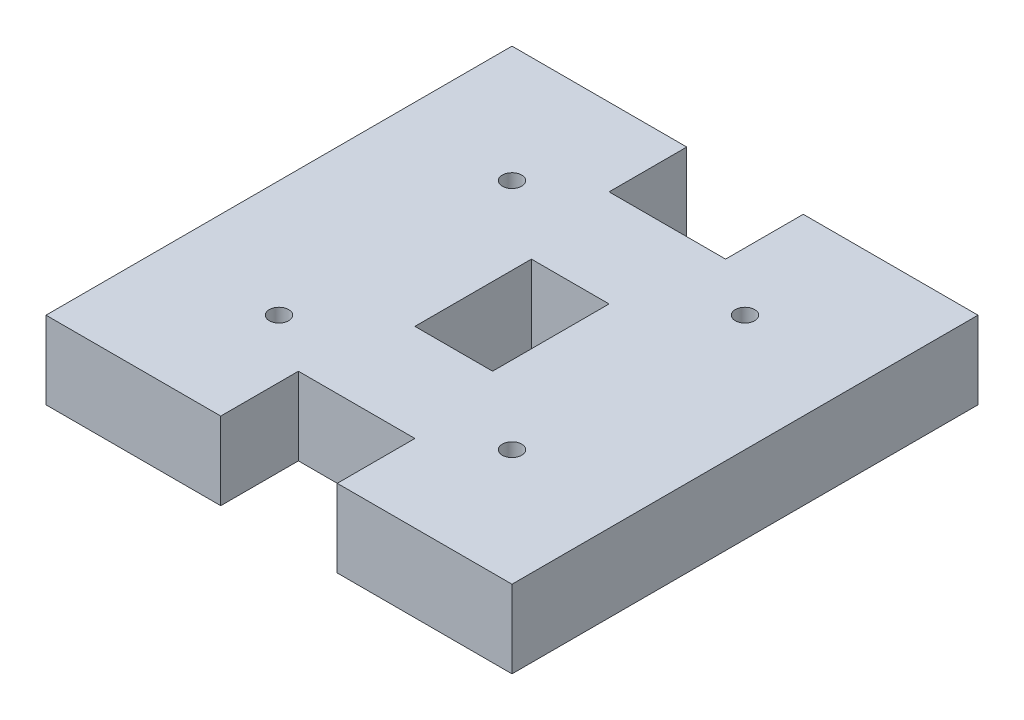
ISO-10303-21;
HEADER;
FILE_DESCRIPTION(('STEP AP214'),'2;1');
FILE_NAME('part.step','',(''),(''),'','','');
FILE_SCHEMA(('AUTOMOTIVE_DESIGN { 1 0 10303 214 1 1 1 1 }'));
ENDSEC;
DATA;
#1=APPLICATION_CONTEXT('core data for automotive mechanical design processes');
#2=APPLICATION_PROTOCOL_DEFINITION('international standard','automotive_design',2000,#1);
#3=PRODUCT_CONTEXT('',#1,'mechanical');
#4=PRODUCT('Part','Part','',(#3));
#5=PRODUCT_RELATED_PRODUCT_CATEGORY('part','',(#4));
#6=PRODUCT_DEFINITION_FORMATION('','',#4);
#7=PRODUCT_DEFINITION_CONTEXT('part definition',#1,'design');
#8=PRODUCT_DEFINITION('design','',#6,#7);
#9=PRODUCT_DEFINITION_SHAPE('','',#8);
#10=(LENGTH_UNIT() NAMED_UNIT(*) SI_UNIT(.MILLI.,.METRE.));
#11=(NAMED_UNIT(*) PLANE_ANGLE_UNIT() SI_UNIT($,.RADIAN.));
#12=(NAMED_UNIT(*) SI_UNIT($,.STERADIAN.) SOLID_ANGLE_UNIT());
#13=UNCERTAINTY_MEASURE_WITH_UNIT(LENGTH_MEASURE(1.E-05),#10,'distance_accuracy_value','');
#14=(GEOMETRIC_REPRESENTATION_CONTEXT(3) GLOBAL_UNCERTAINTY_ASSIGNED_CONTEXT((#13)) GLOBAL_UNIT_ASSIGNED_CONTEXT((#10,
#11,#12)) REPRESENTATION_CONTEXT('',''));
#15=CARTESIAN_POINT('',(0.,0.,0.));
#16=DIRECTION('',(0.,0.,1.));
#17=DIRECTION('',(1.,0.,0.));
#18=AXIS2_PLACEMENT_3D('',#15,#16,#17);
#19=CARTESIAN_POINT('',(60.,10.,-60.));
#20=DIRECTION('',(0.,0.,1.));
#21=DIRECTION('',(1.,0.,0.));
#22=AXIS2_PLACEMENT_3D('',#19,#20,#21);
#23=PLANE('',#22);
#24=DIRECTION('',(-1.,0.,0.));
#25=VECTOR('',#24,1.);
#26=CARTESIAN_POINT('',(60.,10.,-60.));
#27=LINE('',#26,#25);
#28=CARTESIAN_POINT('',(22.5,10.,-60.));
#29=VERTEX_POINT('',#28);
#30=CARTESIAN_POINT('',(0.,10.,-60.));
#31=VERTEX_POINT('',#30);
#32=EDGE_CURVE('E245',#29,#31,#27,.T.);
#33=ORIENTED_EDGE('',*,*,#32,.F.);
#34=DIRECTION('',(0.,1.,0.));
#35=VECTOR('',#34,1.);
#36=CARTESIAN_POINT('',(22.5,0.,-60.));
#37=LINE('',#36,#35);
#38=CARTESIAN_POINT('',(22.5,0.,-60.));
#39=VERTEX_POINT('',#38);
#40=EDGE_CURVE('E191',#39,#29,#37,.T.);
#41=ORIENTED_EDGE('',*,*,#40,.F.);
#42=DIRECTION('',(-1.,0.,0.));
#43=VECTOR('',#42,1.);
#44=CARTESIAN_POINT('',(60.,0.,-60.));
#45=LINE('',#44,#43);
#46=CARTESIAN_POINT('',(0.,0.,-60.));
#47=VERTEX_POINT('',#46);
#48=EDGE_CURVE('E258',#39,#47,#45,.T.);
#49=ORIENTED_EDGE('',*,*,#48,.T.);
#50=DIRECTION('',(0.,-1.,0.));
#51=VECTOR('',#50,1.);
#52=CARTESIAN_POINT('',(0.,10.,-60.));
#53=LINE('',#52,#51);
#54=EDGE_CURVE('E249',#31,#47,#53,.T.);
#55=ORIENTED_EDGE('',*,*,#54,.F.);
#56=EDGE_LOOP('',(#33,#41,#49,#55));
#57=FACE_BOUND('',#56,.T.);
#58=ADVANCED_FACE('F33',(#57),#23,.F.);
#59=CARTESIAN_POINT('',(0.,10.,0.));
#60=DIRECTION('',(0.,0.,-1.));
#61=DIRECTION('',(-1.,0.,0.));
#62=AXIS2_PLACEMENT_3D('',#59,#60,#61);
#63=PLANE('',#62);
#64=DIRECTION('',(1.,0.,0.));
#65=VECTOR('',#64,1.);
#66=CARTESIAN_POINT('',(0.,10.,0.));
#67=LINE('',#66,#65);
#68=CARTESIAN_POINT('',(37.5,10.,0.));
#69=VERTEX_POINT('',#68);
#70=CARTESIAN_POINT('',(60.,10.,0.));
#71=VERTEX_POINT('',#70);
#72=EDGE_CURVE('E238',#69,#71,#67,.T.);
#73=ORIENTED_EDGE('',*,*,#72,.F.);
#74=DIRECTION('',(0.,1.,0.));
#75=VECTOR('',#74,1.);
#76=CARTESIAN_POINT('',(37.5,0.,0.));
#77=LINE('',#76,#75);
#78=CARTESIAN_POINT('',(37.5,0.,0.));
#79=VERTEX_POINT('',#78);
#80=EDGE_CURVE('E215',#79,#69,#77,.T.);
#81=ORIENTED_EDGE('',*,*,#80,.F.);
#82=DIRECTION('',(1.,0.,0.));
#83=VECTOR('',#82,1.);
#84=CARTESIAN_POINT('',(0.,0.,0.));
#85=LINE('',#84,#83);
#86=CARTESIAN_POINT('',(60.,0.,0.));
#87=VERTEX_POINT('',#86);
#88=EDGE_CURVE('E252',#79,#87,#85,.T.);
#89=ORIENTED_EDGE('',*,*,#88,.T.);
#90=DIRECTION('',(0.,-1.,0.));
#91=VECTOR('',#90,1.);
#92=CARTESIAN_POINT('',(60.,10.,0.));
#93=LINE('',#92,#91);
#94=EDGE_CURVE('E41',#71,#87,#93,.T.);
#95=ORIENTED_EDGE('',*,*,#94,.F.);
#96=EDGE_LOOP('',(#73,#81,#89,#95));
#97=FACE_BOUND('',#96,.T.);
#98=ADVANCED_FACE('F290',(#97),#63,.F.);
#99=CARTESIAN_POINT('',(0.,10.,-60.));
#100=DIRECTION('',(1.,0.,0.));
#101=DIRECTION('',(0.,0.,-1.));
#102=AXIS2_PLACEMENT_3D('',#99,#100,#101);
#103=PLANE('',#102);
#104=DIRECTION('',(0.,0.,1.));
#105=VECTOR('',#104,1.);
#106=CARTESIAN_POINT('',(0.,0.,-60.));
#107=LINE('',#106,#105);
#108=CARTESIAN_POINT('',(0.,0.,0.));
#109=VERTEX_POINT('',#108);
#110=EDGE_CURVE('E228',#47,#109,#107,.T.);
#111=ORIENTED_EDGE('',*,*,#110,.T.);
#112=DIRECTION('',(0.,-1.,0.));
#113=VECTOR('',#112,1.);
#114=CARTESIAN_POINT('',(0.,10.,0.));
#115=LINE('',#114,#113);
#116=CARTESIAN_POINT('',(0.,10.,0.));
#117=VERTEX_POINT('',#116);
#118=EDGE_CURVE('E11',#117,#109,#115,.T.);
#119=ORIENTED_EDGE('',*,*,#118,.F.);
#120=DIRECTION('',(0.,0.,1.));
#121=VECTOR('',#120,1.);
#122=CARTESIAN_POINT('',(0.,10.,-60.));
#123=LINE('',#122,#121);
#124=EDGE_CURVE('E235',#31,#117,#123,.T.);
#125=ORIENTED_EDGE('',*,*,#124,.F.);
#126=ORIENTED_EDGE('',*,*,#54,.T.);
#127=EDGE_LOOP('',(#111,#119,#125,#126));
#128=FACE_BOUND('',#127,.T.);
#129=ADVANCED_FACE('F35',(#128),#103,.F.);
#130=CARTESIAN_POINT('',(22.5,0.,0.));
#131=VERTEX_POINT('',#130);
#132=EDGE_CURVE('E253',#109,#131,#85,.T.);
#133=ORIENTED_EDGE('',*,*,#132,.T.);
#134=DIRECTION('',(0.,-1.,0.));
#135=VECTOR('',#134,1.);
#136=CARTESIAN_POINT('',(22.5,10.,0.));
#137=LINE('',#136,#135);
#138=CARTESIAN_POINT('',(22.5,10.,0.));
#139=VERTEX_POINT('',#138);
#140=EDGE_CURVE('E204',#139,#131,#137,.T.);
#141=ORIENTED_EDGE('',*,*,#140,.F.);
#142=EDGE_CURVE('E240',#117,#139,#67,.T.);
#143=ORIENTED_EDGE('',*,*,#142,.F.);
#144=ORIENTED_EDGE('',*,*,#118,.T.);
#145=EDGE_LOOP('',(#133,#141,#143,#144));
#146=FACE_BOUND('',#145,.T.);
#147=ADVANCED_FACE('F303',(#146),#63,.F.);
#148=CARTESIAN_POINT('',(60.,10.,0.));
#149=DIRECTION('',(-1.,0.,0.));
#150=DIRECTION('',(0.,0.,1.));
#151=AXIS2_PLACEMENT_3D('',#148,#149,#150);
#152=PLANE('',#151);
#153=DIRECTION('',(0.,0.,-1.));
#154=VECTOR('',#153,1.);
#155=CARTESIAN_POINT('',(60.,0.,0.));
#156=LINE('',#155,#154);
#157=CARTESIAN_POINT('',(60.,0.,-60.));
#158=VERTEX_POINT('',#157);
#159=EDGE_CURVE('E256',#87,#158,#156,.T.);
#160=ORIENTED_EDGE('',*,*,#159,.T.);
#161=DIRECTION('',(0.,-1.,0.));
#162=VECTOR('',#161,1.);
#163=CARTESIAN_POINT('',(60.,10.,-60.));
#164=LINE('',#163,#162);
#165=CARTESIAN_POINT('',(60.,10.,-60.));
#166=VERTEX_POINT('',#165);
#167=EDGE_CURVE('E263',#166,#158,#164,.T.);
#168=ORIENTED_EDGE('',*,*,#167,.F.);
#169=DIRECTION('',(0.,0.,-1.));
#170=VECTOR('',#169,1.);
#171=CARTESIAN_POINT('',(60.,10.,0.));
#172=LINE('',#171,#170);
#173=EDGE_CURVE('E243',#71,#166,#172,.T.);
#174=ORIENTED_EDGE('',*,*,#173,.F.);
#175=ORIENTED_EDGE('',*,*,#94,.T.);
#176=EDGE_LOOP('',(#160,#168,#174,#175));
#177=FACE_BOUND('',#176,.T.);
#178=ADVANCED_FACE('F270',(#177),#152,.F.);
#179=CARTESIAN_POINT('',(37.5,0.,-60.));
#180=VERTEX_POINT('',#179);
#181=EDGE_CURVE('E239',#158,#180,#45,.T.);
#182=ORIENTED_EDGE('',*,*,#181,.T.);
#183=DIRECTION('',(0.,-1.,0.));
#184=VECTOR('',#183,1.);
#185=CARTESIAN_POINT('',(37.5,10.,-60.));
#186=LINE('',#185,#184);
#187=CARTESIAN_POINT('',(37.5,10.,-60.));
#188=VERTEX_POINT('',#187);
#189=EDGE_CURVE('E183',#188,#180,#186,.T.);
#190=ORIENTED_EDGE('',*,*,#189,.F.);
#191=EDGE_CURVE('E246',#166,#188,#27,.T.);
#192=ORIENTED_EDGE('',*,*,#191,.F.);
#193=ORIENTED_EDGE('',*,*,#167,.T.);
#194=EDGE_LOOP('',(#182,#190,#192,#193));
#195=FACE_BOUND('',#194,.T.);
#196=ADVANCED_FACE('F282',(#195),#23,.F.);
#197=CARTESIAN_POINT('',(0.,10.,0.));
#198=DIRECTION('',(0.,1.,0.));
#199=DIRECTION('',(0.,0.,1.));
#200=AXIS2_PLACEMENT_3D('',#197,#198,#199);
#201=PLANE('',#200);
#202=CARTESIAN_POINT('',(15.,10.,-44.9999999999999));
#203=DIRECTION('',(0.,1.,0.));
#204=DIRECTION('',(0.,0.,1.));
#205=AXIS2_PLACEMENT_3D('',#202,#203,#204);
#206=CIRCLE('',#205,1.25);
#207=CARTESIAN_POINT('',(15.,10.,-43.7499999999999));
#208=VERTEX_POINT('',#207);
#209=EDGE_CURVE('E507',#208,#208,#206,.T.);
#210=ORIENTED_EDGE('',*,*,#209,.F.);
#211=EDGE_LOOP('',(#210));
#212=FACE_BOUND('',#211,.T.);
#213=CARTESIAN_POINT('',(45.,10.,-15.));
#214=DIRECTION('',(0.,1.,0.));
#215=DIRECTION('',(0.,0.,1.));
#216=AXIS2_PLACEMENT_3D('',#213,#214,#215);
#217=CIRCLE('',#216,1.25);
#218=CARTESIAN_POINT('',(45.,10.,-13.75));
#219=VERTEX_POINT('',#218);
#220=EDGE_CURVE('E512',#219,#219,#217,.T.);
#221=ORIENTED_EDGE('',*,*,#220,.F.);
#222=EDGE_LOOP('',(#221));
#223=FACE_BOUND('',#222,.T.);
#224=CARTESIAN_POINT('',(15.,10.,-14.9999999999999));
#225=DIRECTION('',(0.,1.,0.));
#226=DIRECTION('',(0.,0.,1.));
#227=AXIS2_PLACEMENT_3D('',#224,#225,#226);
#228=CIRCLE('',#227,1.25);
#229=CARTESIAN_POINT('',(15.,10.,-13.7499999999999));
#230=VERTEX_POINT('',#229);
#231=EDGE_CURVE('E520',#230,#230,#228,.T.);
#232=ORIENTED_EDGE('',*,*,#231,.F.);
#233=EDGE_LOOP('',(#232));
#234=FACE_BOUND('',#233,.T.);
#235=CARTESIAN_POINT('',(45.,10.,-45.));
#236=DIRECTION('',(0.,1.,0.));
#237=DIRECTION('',(0.,0.,1.));
#238=AXIS2_PLACEMENT_3D('',#235,#236,#237);
#239=CIRCLE('',#238,1.25);
#240=CARTESIAN_POINT('',(45.,10.,-43.75));
#241=VERTEX_POINT('',#240);
#242=EDGE_CURVE('E170',#241,#241,#239,.T.);
#243=ORIENTED_EDGE('',*,*,#242,.F.);
#244=EDGE_LOOP('',(#243));
#245=FACE_BOUND('',#244,.T.);
#246=DIRECTION('',(0.,0.,1.));
#247=VECTOR('',#246,1.);
#248=CARTESIAN_POINT('',(25.,10.,-22.5));
#249=LINE('',#248,#247);
#250=CARTESIAN_POINT('',(25.,10.,-37.5));
#251=VERTEX_POINT('',#250);
#252=CARTESIAN_POINT('',(25.,10.,-22.5));
#253=VERTEX_POINT('',#252);
#254=EDGE_CURVE('E48',#251,#253,#249,.T.);
#255=ORIENTED_EDGE('',*,*,#254,.F.);
#256=DIRECTION('',(-1.,0.,0.));
#257=VECTOR('',#256,1.);
#258=CARTESIAN_POINT('',(25.,10.,-37.5));
#259=LINE('',#258,#257);
#260=CARTESIAN_POINT('',(35.,10.,-37.5));
#261=VERTEX_POINT('',#260);
#262=EDGE_CURVE('E164',#261,#251,#259,.T.);
#263=ORIENTED_EDGE('',*,*,#262,.F.);
#264=DIRECTION('',(0.,0.,-1.));
#265=VECTOR('',#264,1.);
#266=CARTESIAN_POINT('',(35.,10.,-37.5));
#267=LINE('',#266,#265);
#268=CARTESIAN_POINT('',(35.,10.,-22.5));
#269=VERTEX_POINT('',#268);
#270=EDGE_CURVE('E167',#269,#261,#267,.T.);
#271=ORIENTED_EDGE('',*,*,#270,.F.);
#272=DIRECTION('',(1.,0.,0.));
#273=VECTOR('',#272,1.);
#274=CARTESIAN_POINT('',(35.,10.,-22.5));
#275=LINE('',#274,#273);
#276=EDGE_CURVE('E176',#253,#269,#275,.T.);
#277=ORIENTED_EDGE('',*,*,#276,.F.);
#278=EDGE_LOOP('',(#255,#263,#271,#277));
#279=FACE_BOUND('',#278,.T.);
#280=DIRECTION('',(0.,0.,-1.));
#281=VECTOR('',#280,1.);
#282=CARTESIAN_POINT('',(22.5,10.,-50.));
#283=LINE('',#282,#281);
#284=CARTESIAN_POINT('',(22.5,10.,-50.));
#285=VERTEX_POINT('',#284);
#286=EDGE_CURVE('E201',#285,#29,#283,.T.);
#287=ORIENTED_EDGE('',*,*,#286,.T.);
#288=ORIENTED_EDGE('',*,*,#32,.T.);
#289=ORIENTED_EDGE('',*,*,#124,.T.);
#290=ORIENTED_EDGE('',*,*,#142,.T.);
#291=DIRECTION('',(0.,0.,1.));
#292=VECTOR('',#291,1.);
#293=CARTESIAN_POINT('',(22.5,10.,-10.));
#294=LINE('',#293,#292);
#295=CARTESIAN_POINT('',(22.5,10.,-10.));
#296=VERTEX_POINT('',#295);
#297=EDGE_CURVE('E222',#296,#139,#294,.T.);
#298=ORIENTED_EDGE('',*,*,#297,.F.);
#299=DIRECTION('',(-1.,0.,0.));
#300=VECTOR('',#299,1.);
#301=CARTESIAN_POINT('',(37.5,10.,-10.));
#302=LINE('',#301,#300);
#303=CARTESIAN_POINT('',(37.5,10.,-10.));
#304=VERTEX_POINT('',#303);
#305=EDGE_CURVE('E211',#304,#296,#302,.T.);
#306=ORIENTED_EDGE('',*,*,#305,.F.);
#307=DIRECTION('',(0.,0.,1.));
#308=VECTOR('',#307,1.);
#309=CARTESIAN_POINT('',(37.5,10.,-10.));
#310=LINE('',#309,#308);
#311=EDGE_CURVE('E225',#304,#69,#310,.T.);
#312=ORIENTED_EDGE('',*,*,#311,.T.);
#313=ORIENTED_EDGE('',*,*,#72,.T.);
#314=ORIENTED_EDGE('',*,*,#173,.T.);
#315=ORIENTED_EDGE('',*,*,#191,.T.);
#316=DIRECTION('',(0.,0.,-1.));
#317=VECTOR('',#316,1.);
#318=CARTESIAN_POINT('',(37.5,10.,-50.));
#319=LINE('',#318,#317);
#320=CARTESIAN_POINT('',(37.5,10.,-50.));
#321=VERTEX_POINT('',#320);
#322=EDGE_CURVE('E198',#321,#188,#319,.T.);
#323=ORIENTED_EDGE('',*,*,#322,.F.);
#324=DIRECTION('',(1.,0.,0.));
#325=VECTOR('',#324,1.);
#326=CARTESIAN_POINT('',(22.5,10.,-50.));
#327=LINE('',#326,#325);
#328=EDGE_CURVE('E187',#285,#321,#327,.T.);
#329=ORIENTED_EDGE('',*,*,#328,.F.);
#330=EDGE_LOOP('',(#287,#288,#289,#290,#298,#306,#312,#313,#314,#315,#323,#329));
#331=FACE_BOUND('',#330,.T.);
#332=ADVANCED_FACE('F286',(#212,#223,#234,#245,#279,#331),#201,.T.);
#333=CARTESIAN_POINT('',(0.,0.,0.));
#334=DIRECTION('',(0.,1.,0.));
#335=DIRECTION('',(0.,0.,1.));
#336=AXIS2_PLACEMENT_3D('',#333,#334,#335);
#337=PLANE('',#336);
#338=CARTESIAN_POINT('',(15.,0.,-44.9999999999999));
#339=DIRECTION('',(0.,1.,0.));
#340=DIRECTION('',(0.,0.,1.));
#341=AXIS2_PLACEMENT_3D('',#338,#339,#340);
#342=CIRCLE('',#341,1.25);
#343=CARTESIAN_POINT('',(15.,0.,-43.7499999999999));
#344=VERTEX_POINT('',#343);
#345=EDGE_CURVE('E504',#344,#344,#342,.T.);
#346=ORIENTED_EDGE('',*,*,#345,.T.);
#347=EDGE_LOOP('',(#346));
#348=FACE_BOUND('',#347,.T.);
#349=CARTESIAN_POINT('',(45.,0.,-15.));
#350=DIRECTION('',(0.,1.,0.));
#351=DIRECTION('',(0.,0.,1.));
#352=AXIS2_PLACEMENT_3D('',#349,#350,#351);
#353=CIRCLE('',#352,1.25);
#354=CARTESIAN_POINT('',(45.,0.,-13.75));
#355=VERTEX_POINT('',#354);
#356=EDGE_CURVE('E508',#355,#355,#353,.T.);
#357=ORIENTED_EDGE('',*,*,#356,.T.);
#358=EDGE_LOOP('',(#357));
#359=FACE_BOUND('',#358,.T.);
#360=CARTESIAN_POINT('',(15.,0.,-14.9999999999999));
#361=DIRECTION('',(0.,1.,0.));
#362=DIRECTION('',(0.,0.,1.));
#363=AXIS2_PLACEMENT_3D('',#360,#361,#362);
#364=CIRCLE('',#363,1.25);
#365=CARTESIAN_POINT('',(15.,0.,-13.7499999999999));
#366=VERTEX_POINT('',#365);
#367=EDGE_CURVE('E517',#366,#366,#364,.T.);
#368=ORIENTED_EDGE('',*,*,#367,.T.);
#369=EDGE_LOOP('',(#368));
#370=FACE_BOUND('',#369,.T.);
#371=CARTESIAN_POINT('',(45.,0.,-45.));
#372=DIRECTION('',(0.,1.,0.));
#373=DIRECTION('',(0.,0.,1.));
#374=AXIS2_PLACEMENT_3D('',#371,#372,#373);
#375=CIRCLE('',#374,1.25);
#376=CARTESIAN_POINT('',(45.,0.,-43.75));
#377=VERTEX_POINT('',#376);
#378=EDGE_CURVE('E177',#377,#377,#375,.T.);
#379=ORIENTED_EDGE('',*,*,#378,.T.);
#380=EDGE_LOOP('',(#379));
#381=FACE_BOUND('',#380,.T.);
#382=DIRECTION('',(-1.,0.,0.));
#383=VECTOR('',#382,1.);
#384=CARTESIAN_POINT('',(25.,0.,-37.5));
#385=LINE('',#384,#383);
#386=CARTESIAN_POINT('',(35.,0.,-37.5));
#387=VERTEX_POINT('',#386);
#388=CARTESIAN_POINT('',(25.,0.,-37.5));
#389=VERTEX_POINT('',#388);
#390=EDGE_CURVE('E154',#387,#389,#385,.T.);
#391=ORIENTED_EDGE('',*,*,#390,.T.);
#392=DIRECTION('',(0.,0.,1.));
#393=VECTOR('',#392,1.);
#394=CARTESIAN_POINT('',(25.,0.,-22.5));
#395=LINE('',#394,#393);
#396=CARTESIAN_POINT('',(25.,0.,-22.5));
#397=VERTEX_POINT('',#396);
#398=EDGE_CURVE('E148',#389,#397,#395,.T.);
#399=ORIENTED_EDGE('',*,*,#398,.T.);
#400=DIRECTION('',(1.,0.,0.));
#401=VECTOR('',#400,1.);
#402=CARTESIAN_POINT('',(35.,0.,-22.5));
#403=LINE('',#402,#401);
#404=CARTESIAN_POINT('',(35.,0.,-22.5));
#405=VERTEX_POINT('',#404);
#406=EDGE_CURVE('E157',#397,#405,#403,.T.);
#407=ORIENTED_EDGE('',*,*,#406,.T.);
#408=DIRECTION('',(0.,0.,-1.));
#409=VECTOR('',#408,1.);
#410=CARTESIAN_POINT('',(35.,0.,-37.5));
#411=LINE('',#410,#409);
#412=EDGE_CURVE('E56',#405,#387,#411,.T.);
#413=ORIENTED_EDGE('',*,*,#412,.T.);
#414=EDGE_LOOP('',(#391,#399,#407,#413));
#415=FACE_BOUND('',#414,.T.);
#416=ORIENTED_EDGE('',*,*,#48,.F.);
#417=DIRECTION('',(0.,0.,-1.));
#418=VECTOR('',#417,1.);
#419=CARTESIAN_POINT('',(22.5,0.,-50.));
#420=LINE('',#419,#418);
#421=CARTESIAN_POINT('',(22.5,0.,-50.));
#422=VERTEX_POINT('',#421);
#423=EDGE_CURVE('E205',#422,#39,#420,.T.);
#424=ORIENTED_EDGE('',*,*,#423,.F.);
#425=DIRECTION('',(-1.,0.,0.));
#426=VECTOR('',#425,1.);
#427=CARTESIAN_POINT('',(37.5,0.,-50.));
#428=LINE('',#427,#426);
#429=CARTESIAN_POINT('',(37.5,0.,-50.));
#430=VERTEX_POINT('',#429);
#431=EDGE_CURVE('E193',#430,#422,#428,.T.);
#432=ORIENTED_EDGE('',*,*,#431,.F.);
#433=DIRECTION('',(0.,0.,-1.));
#434=VECTOR('',#433,1.);
#435=CARTESIAN_POINT('',(37.5,0.,-50.));
#436=LINE('',#435,#434);
#437=EDGE_CURVE('E207',#430,#180,#436,.T.);
#438=ORIENTED_EDGE('',*,*,#437,.T.);
#439=ORIENTED_EDGE('',*,*,#181,.F.);
#440=ORIENTED_EDGE('',*,*,#159,.F.);
#441=ORIENTED_EDGE('',*,*,#88,.F.);
#442=DIRECTION('',(0.,0.,1.));
#443=VECTOR('',#442,1.);
#444=CARTESIAN_POINT('',(37.5,0.,-10.));
#445=LINE('',#444,#443);
#446=CARTESIAN_POINT('',(37.5,0.,-10.));
#447=VERTEX_POINT('',#446);
#448=EDGE_CURVE('E229',#447,#79,#445,.T.);
#449=ORIENTED_EDGE('',*,*,#448,.F.);
#450=DIRECTION('',(1.,0.,0.));
#451=VECTOR('',#450,1.);
#452=CARTESIAN_POINT('',(22.5,0.,-10.));
#453=LINE('',#452,#451);
#454=CARTESIAN_POINT('',(22.5,0.,-10.));
#455=VERTEX_POINT('',#454);
#456=EDGE_CURVE('E217',#455,#447,#453,.T.);
#457=ORIENTED_EDGE('',*,*,#456,.F.);
#458=DIRECTION('',(0.,0.,1.));
#459=VECTOR('',#458,1.);
#460=CARTESIAN_POINT('',(22.5,0.,-10.));
#461=LINE('',#460,#459);
#462=EDGE_CURVE('E231',#455,#131,#461,.T.);
#463=ORIENTED_EDGE('',*,*,#462,.T.);
#464=ORIENTED_EDGE('',*,*,#132,.F.);
#465=ORIENTED_EDGE('',*,*,#110,.F.);
#466=EDGE_LOOP('',(#416,#424,#432,#438,#439,#440,#441,#449,#457,#463,#464,#465));
#467=FACE_BOUND('',#466,.T.);
#468=ADVANCED_FACE('F161',(#348,#359,#370,#381,#415,#467),#337,.F.);
#469=CARTESIAN_POINT('',(37.5,0.,-10.));
#470=DIRECTION('',(1.,0.,0.));
#471=DIRECTION('',(0.,0.,-1.));
#472=AXIS2_PLACEMENT_3D('',#469,#470,#471);
#473=PLANE('',#472);
#474=ORIENTED_EDGE('',*,*,#80,.T.);
#475=ORIENTED_EDGE('',*,*,#311,.F.);
#476=DIRECTION('',(0.,1.,0.));
#477=VECTOR('',#476,1.);
#478=CARTESIAN_POINT('',(37.5,0.,-10.));
#479=LINE('',#478,#477);
#480=EDGE_CURVE('E219',#447,#304,#479,.T.);
#481=ORIENTED_EDGE('',*,*,#480,.F.);
#482=ORIENTED_EDGE('',*,*,#448,.T.);
#483=EDGE_LOOP('',(#474,#475,#481,#482));
#484=FACE_BOUND('',#483,.T.);
#485=ADVANCED_FACE('F292',(#484),#473,.F.);
#486=CARTESIAN_POINT('',(22.5,10.,-10.));
#487=DIRECTION('',(-1.,0.,0.));
#488=DIRECTION('',(0.,0.,1.));
#489=AXIS2_PLACEMENT_3D('',#486,#487,#488);
#490=PLANE('',#489);
#491=ORIENTED_EDGE('',*,*,#140,.T.);
#492=ORIENTED_EDGE('',*,*,#462,.F.);
#493=DIRECTION('',(0.,-1.,0.));
#494=VECTOR('',#493,1.);
#495=CARTESIAN_POINT('',(22.5,10.,-10.));
#496=LINE('',#495,#494);
#497=EDGE_CURVE('E214',#296,#455,#496,.T.);
#498=ORIENTED_EDGE('',*,*,#497,.F.);
#499=ORIENTED_EDGE('',*,*,#297,.T.);
#500=EDGE_LOOP('',(#491,#492,#498,#499));
#501=FACE_BOUND('',#500,.T.);
#502=ADVANCED_FACE('F300',(#501),#490,.F.);
#503=CARTESIAN_POINT('',(0.,0.,-10.));
#504=DIRECTION('',(0.,0.,1.));
#505=DIRECTION('',(1.,0.,0.));
#506=AXIS2_PLACEMENT_3D('',#503,#504,#505);
#507=PLANE('',#506);
#508=ORIENTED_EDGE('',*,*,#305,.T.);
#509=ORIENTED_EDGE('',*,*,#497,.T.);
#510=ORIENTED_EDGE('',*,*,#456,.T.);
#511=ORIENTED_EDGE('',*,*,#480,.T.);
#512=EDGE_LOOP('',(#508,#509,#510,#511));
#513=FACE_BOUND('',#512,.T.);
#514=ADVANCED_FACE('F297',(#513),#507,.T.);
#515=CARTESIAN_POINT('',(22.5,0.,-50.));
#516=DIRECTION('',(-1.,0.,0.));
#517=DIRECTION('',(0.,0.,1.));
#518=AXIS2_PLACEMENT_3D('',#515,#516,#517);
#519=PLANE('',#518);
#520=ORIENTED_EDGE('',*,*,#40,.T.);
#521=ORIENTED_EDGE('',*,*,#286,.F.);
#522=DIRECTION('',(0.,1.,0.));
#523=VECTOR('',#522,1.);
#524=CARTESIAN_POINT('',(22.5,0.,-50.));
#525=LINE('',#524,#523);
#526=EDGE_CURVE('E195',#422,#285,#525,.T.);
#527=ORIENTED_EDGE('',*,*,#526,.F.);
#528=ORIENTED_EDGE('',*,*,#423,.T.);
#529=EDGE_LOOP('',(#520,#521,#527,#528));
#530=FACE_BOUND('',#529,.T.);
#531=ADVANCED_FACE('F314',(#530),#519,.F.);
#532=CARTESIAN_POINT('',(37.5,10.,-50.));
#533=DIRECTION('',(1.,0.,0.));
#534=DIRECTION('',(0.,0.,-1.));
#535=AXIS2_PLACEMENT_3D('',#532,#533,#534);
#536=PLANE('',#535);
#537=ORIENTED_EDGE('',*,*,#189,.T.);
#538=ORIENTED_EDGE('',*,*,#437,.F.);
#539=DIRECTION('',(0.,-1.,0.));
#540=VECTOR('',#539,1.);
#541=CARTESIAN_POINT('',(37.5,10.,-50.));
#542=LINE('',#541,#540);
#543=EDGE_CURVE('E190',#321,#430,#542,.T.);
#544=ORIENTED_EDGE('',*,*,#543,.F.);
#545=ORIENTED_EDGE('',*,*,#322,.T.);
#546=EDGE_LOOP('',(#537,#538,#544,#545));
#547=FACE_BOUND('',#546,.T.);
#548=ADVANCED_FACE('F319',(#547),#536,.F.);
#549=CARTESIAN_POINT('',(0.,0.,-50.));
#550=DIRECTION('',(0.,0.,-1.));
#551=DIRECTION('',(-1.,0.,0.));
#552=AXIS2_PLACEMENT_3D('',#549,#550,#551);
#553=PLANE('',#552);
#554=ORIENTED_EDGE('',*,*,#328,.T.);
#555=ORIENTED_EDGE('',*,*,#543,.T.);
#556=ORIENTED_EDGE('',*,*,#431,.T.);
#557=ORIENTED_EDGE('',*,*,#526,.T.);
#558=EDGE_LOOP('',(#554,#555,#556,#557));
#559=FACE_BOUND('',#558,.T.);
#560=ADVANCED_FACE('F317',(#559),#553,.T.);
#561=CARTESIAN_POINT('',(25.,0.,-22.5));
#562=DIRECTION('',(-1.,0.,0.));
#563=DIRECTION('',(0.,0.,1.));
#564=AXIS2_PLACEMENT_3D('',#561,#562,#563);
#565=PLANE('',#564);
#566=ORIENTED_EDGE('',*,*,#254,.T.);
#567=DIRECTION('',(0.,1.,0.));
#568=VECTOR('',#567,1.);
#569=CARTESIAN_POINT('',(25.,0.,-22.5));
#570=LINE('',#569,#568);
#571=EDGE_CURVE('E144',#397,#253,#570,.T.);
#572=ORIENTED_EDGE('',*,*,#571,.F.);
#573=ORIENTED_EDGE('',*,*,#398,.F.);
#574=DIRECTION('',(0.,1.,0.));
#575=VECTOR('',#574,1.);
#576=CARTESIAN_POINT('',(25.,0.,-37.5));
#577=LINE('',#576,#575);
#578=EDGE_CURVE('E181',#389,#251,#577,.T.);
#579=ORIENTED_EDGE('',*,*,#578,.T.);
#580=EDGE_LOOP('',(#566,#572,#573,#579));
#581=FACE_BOUND('',#580,.T.);
#582=ADVANCED_FACE('F146',(#581),#565,.F.);
#583=CARTESIAN_POINT('',(25.,0.,-37.5));
#584=DIRECTION('',(0.,0.,-1.));
#585=DIRECTION('',(-1.,0.,0.));
#586=AXIS2_PLACEMENT_3D('',#583,#584,#585);
#587=PLANE('',#586);
#588=ORIENTED_EDGE('',*,*,#262,.T.);
#589=ORIENTED_EDGE('',*,*,#578,.F.);
#590=ORIENTED_EDGE('',*,*,#390,.F.);
#591=DIRECTION('',(0.,1.,0.));
#592=VECTOR('',#591,1.);
#593=CARTESIAN_POINT('',(35.,0.,-37.5));
#594=LINE('',#593,#592);
#595=EDGE_CURVE('E184',#387,#261,#594,.T.);
#596=ORIENTED_EDGE('',*,*,#595,.T.);
#597=EDGE_LOOP('',(#588,#589,#590,#596));
#598=FACE_BOUND('',#597,.T.);
#599=ADVANCED_FACE('F420',(#598),#587,.F.);
#600=CARTESIAN_POINT('',(35.,0.,-37.5));
#601=DIRECTION('',(1.,0.,0.));
#602=DIRECTION('',(0.,0.,-1.));
#603=AXIS2_PLACEMENT_3D('',#600,#601,#602);
#604=PLANE('',#603);
#605=ORIENTED_EDGE('',*,*,#270,.T.);
#606=ORIENTED_EDGE('',*,*,#595,.F.);
#607=ORIENTED_EDGE('',*,*,#412,.F.);
#608=DIRECTION('',(0.,1.,0.));
#609=VECTOR('',#608,1.);
#610=CARTESIAN_POINT('',(35.,0.,-22.5));
#611=LINE('',#610,#609);
#612=EDGE_CURVE('E153',#405,#269,#611,.T.);
#613=ORIENTED_EDGE('',*,*,#612,.T.);
#614=EDGE_LOOP('',(#605,#606,#607,#613));
#615=FACE_BOUND('',#614,.T.);
#616=ADVANCED_FACE('F429',(#615),#604,.F.);
#617=CARTESIAN_POINT('',(35.,0.,-22.5));
#618=DIRECTION('',(0.,0.,1.));
#619=DIRECTION('',(1.,0.,0.));
#620=AXIS2_PLACEMENT_3D('',#617,#618,#619);
#621=PLANE('',#620);
#622=ORIENTED_EDGE('',*,*,#276,.T.);
#623=ORIENTED_EDGE('',*,*,#612,.F.);
#624=ORIENTED_EDGE('',*,*,#406,.F.);
#625=ORIENTED_EDGE('',*,*,#571,.T.);
#626=EDGE_LOOP('',(#622,#623,#624,#625));
#627=FACE_BOUND('',#626,.T.);
#628=ADVANCED_FACE('F158',(#627),#621,.F.);
#629=CARTESIAN_POINT('',(45.,0.,-45.));
#630=DIRECTION('',(0.,1.,0.));
#631=DIRECTION('',(0.,0.,1.));
#632=AXIS2_PLACEMENT_3D('',#629,#630,#631);
#633=CYLINDRICAL_SURFACE('',#632,1.25);
#634=ORIENTED_EDGE('',*,*,#378,.F.);
#635=EDGE_LOOP('',(#634));
#636=FACE_BOUND('',#635,.T.);
#637=ORIENTED_EDGE('',*,*,#242,.T.);
#638=EDGE_LOOP('',(#637));
#639=FACE_BOUND('',#638,.T.);
#640=ADVANCED_FACE('F447',(#636,#639),#633,.F.);
#641=CARTESIAN_POINT('',(15.,0.,-14.9999999999999));
#642=DIRECTION('',(0.,1.,0.));
#643=DIRECTION('',(0.,0.,1.));
#644=AXIS2_PLACEMENT_3D('',#641,#642,#643);
#645=CYLINDRICAL_SURFACE('',#644,1.25);
#646=ORIENTED_EDGE('',*,*,#367,.F.);
#647=EDGE_LOOP('',(#646));
#648=FACE_BOUND('',#647,.T.);
#649=ORIENTED_EDGE('',*,*,#231,.T.);
#650=EDGE_LOOP('',(#649));
#651=FACE_BOUND('',#650,.T.);
#652=ADVANCED_FACE('F467',(#648,#651),#645,.F.);
#653=CARTESIAN_POINT('',(45.,0.,-15.));
#654=DIRECTION('',(0.,1.,0.));
#655=DIRECTION('',(0.,0.,1.));
#656=AXIS2_PLACEMENT_3D('',#653,#654,#655);
#657=CYLINDRICAL_SURFACE('',#656,1.25);
#658=ORIENTED_EDGE('',*,*,#356,.F.);
#659=EDGE_LOOP('',(#658));
#660=FACE_BOUND('',#659,.T.);
#661=ORIENTED_EDGE('',*,*,#220,.T.);
#662=EDGE_LOOP('',(#661));
#663=FACE_BOUND('',#662,.T.);
#664=ADVANCED_FACE('F477',(#660,#663),#657,.F.);
#665=CARTESIAN_POINT('',(15.,0.,-44.9999999999999));
#666=DIRECTION('',(0.,1.,0.));
#667=DIRECTION('',(0.,0.,1.));
#668=AXIS2_PLACEMENT_3D('',#665,#666,#667);
#669=CYLINDRICAL_SURFACE('',#668,1.25);
#670=ORIENTED_EDGE('',*,*,#345,.F.);
#671=EDGE_LOOP('',(#670));
#672=FACE_BOUND('',#671,.T.);
#673=ORIENTED_EDGE('',*,*,#209,.T.);
#674=EDGE_LOOP('',(#673));
#675=FACE_BOUND('',#674,.T.);
#676=ADVANCED_FACE('F487',(#672,#675),#669,.F.);
#677=CLOSED_SHELL('',(#58,#98,#129,#147,#178,#196,#332,#468,#485,#502,#514,#531,#548,#560,#582,
#599,#616,#628,#640,#652,#664,#676));
#678=MANIFOLD_SOLID_BREP('B2',#677);
#679=ADVANCED_BREP_SHAPE_REPRESENTATION('',(#18,#678),#14);
#680=SHAPE_DEFINITION_REPRESENTATION(#9,#679);
ENDSEC;
END-ISO-10303-21;
